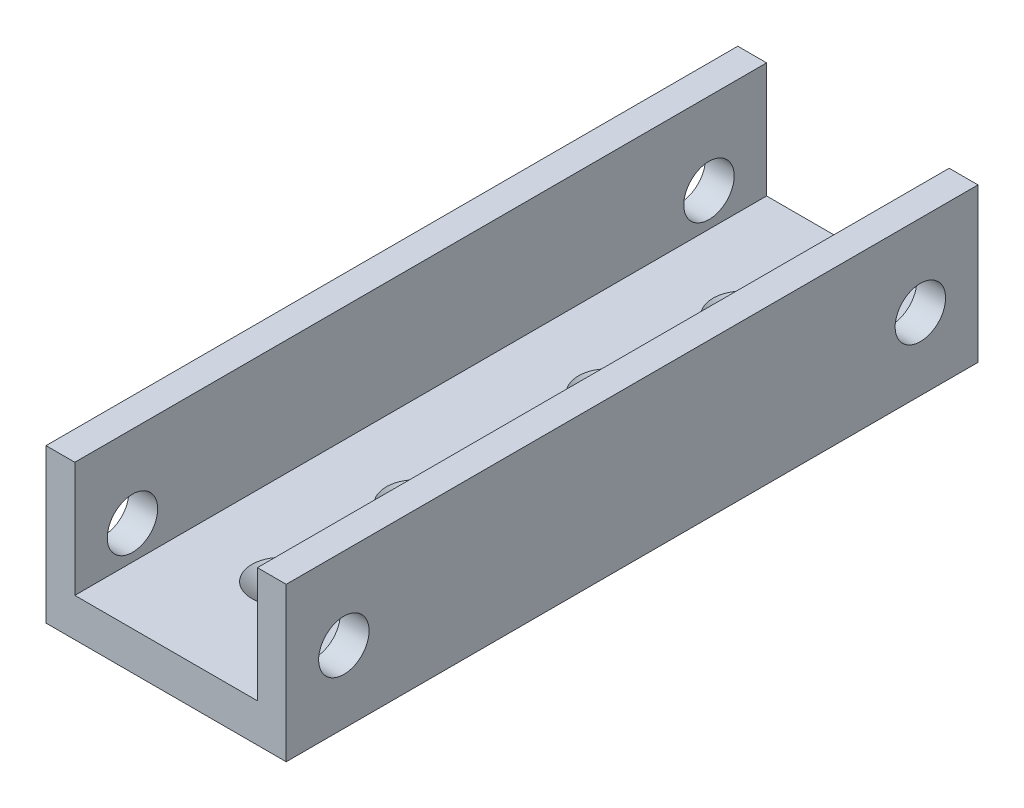
ISO-10303-21;
HEADER;
FILE_DESCRIPTION(('STEP AP214'),'2;1');
FILE_NAME('part.step','',(''),(''),'','','');
FILE_SCHEMA(('AUTOMOTIVE_DESIGN { 1 0 10303 214 1 1 1 1 }'));
ENDSEC;
DATA;
#1=APPLICATION_CONTEXT('core data for automotive mechanical design processes');
#2=APPLICATION_PROTOCOL_DEFINITION('international standard','automotive_design',2000,#1);
#3=PRODUCT_CONTEXT('',#1,'mechanical');
#4=PRODUCT('Part','Part','',(#3));
#5=PRODUCT_RELATED_PRODUCT_CATEGORY('part','',(#4));
#6=PRODUCT_DEFINITION_FORMATION('','',#4);
#7=PRODUCT_DEFINITION_CONTEXT('part definition',#1,'design');
#8=PRODUCT_DEFINITION('design','',#6,#7);
#9=PRODUCT_DEFINITION_SHAPE('','',#8);
#10=(LENGTH_UNIT() NAMED_UNIT(*) SI_UNIT(.MILLI.,.METRE.));
#11=(NAMED_UNIT(*) PLANE_ANGLE_UNIT() SI_UNIT($,.RADIAN.));
#12=(NAMED_UNIT(*) SI_UNIT($,.STERADIAN.) SOLID_ANGLE_UNIT());
#13=UNCERTAINTY_MEASURE_WITH_UNIT(LENGTH_MEASURE(1.E-05),#10,'distance_accuracy_value','');
#14=(GEOMETRIC_REPRESENTATION_CONTEXT(3) GLOBAL_UNCERTAINTY_ASSIGNED_CONTEXT((#13)) GLOBAL_UNIT_ASSIGNED_CONTEXT((#10,
#11,#12)) REPRESENTATION_CONTEXT('',''));
#15=CARTESIAN_POINT('',(0.,0.,0.));
#16=DIRECTION('',(0.,0.,1.));
#17=DIRECTION('',(1.,0.,0.));
#18=AXIS2_PLACEMENT_3D('',#15,#16,#17);
#19=CARTESIAN_POINT('',(-15.08125,6.35,57.15));
#20=DIRECTION('',(-1.,0.,0.));
#21=DIRECTION('',(0.,-1.,0.));
#22=AXIS2_PLACEMENT_3D('',#19,#20,#21);
#23=PLANE('',#22);
#24=CARTESIAN_POINT('',(-15.08125,11.90625,-47.625));
#25=DIRECTION('',(-1.,0.,0.));
#26=DIRECTION('',(0.,-1.,0.));
#27=AXIS2_PLACEMENT_3D('',#24,#25,#26);
#28=CIRCLE('',#27,4.1671875);
#29=CARTESIAN_POINT('',(-15.08125,16.0734375,-47.625));
#30=VERTEX_POINT('',#29);
#31=EDGE_CURVE('E173',#30,#30,#28,.T.);
#32=ORIENTED_EDGE('',*,*,#31,.T.);
#33=EDGE_LOOP('',(#32));
#34=FACE_BOUND('',#33,.T.);
#35=CARTESIAN_POINT('',(-15.08125,11.90625,47.625));
#36=DIRECTION('',(-1.,0.,0.));
#37=DIRECTION('',(0.,-1.,0.));
#38=AXIS2_PLACEMENT_3D('',#35,#36,#37);
#39=CIRCLE('',#38,4.1671875);
#40=CARTESIAN_POINT('',(-15.08125,16.0734375,47.625));
#41=VERTEX_POINT('',#40);
#42=EDGE_CURVE('E160',#41,#41,#39,.T.);
#43=ORIENTED_EDGE('',*,*,#42,.T.);
#44=EDGE_LOOP('',(#43));
#45=FACE_BOUND('',#44,.T.);
#46=DIRECTION('',(0.,1.,0.));
#47=VECTOR('',#46,1.);
#48=CARTESIAN_POINT('',(-15.08125,6.35,-57.15));
#49=LINE('',#48,#47);
#50=CARTESIAN_POINT('',(-15.08125,6.35,-57.15));
#51=VERTEX_POINT('',#50);
#52=CARTESIAN_POINT('',(-15.08125,25.4,-57.15));
#53=VERTEX_POINT('',#52);
#54=EDGE_CURVE('E132',#51,#53,#49,.T.);
#55=ORIENTED_EDGE('',*,*,#54,.T.);
#56=DIRECTION('',(0.,0.,-1.));
#57=VECTOR('',#56,1.);
#58=CARTESIAN_POINT('',(-15.08125,25.4,57.15));
#59=LINE('',#58,#57);
#60=CARTESIAN_POINT('',(-15.08125,25.4,57.15));
#61=VERTEX_POINT('',#60);
#62=EDGE_CURVE('E12',#61,#53,#59,.T.);
#63=ORIENTED_EDGE('',*,*,#62,.F.);
#64=DIRECTION('',(0.,1.,0.));
#65=VECTOR('',#64,1.);
#66=CARTESIAN_POINT('',(-15.08125,6.35,57.15));
#67=LINE('',#66,#65);
#68=CARTESIAN_POINT('',(-15.08125,6.35,57.15));
#69=VERTEX_POINT('',#68);
#70=EDGE_CURVE('E147',#69,#61,#67,.T.);
#71=ORIENTED_EDGE('',*,*,#70,.F.);
#72=DIRECTION('',(0.,0.,-1.));
#73=VECTOR('',#72,1.);
#74=CARTESIAN_POINT('',(-15.08125,6.35,57.15));
#75=LINE('',#74,#73);
#76=EDGE_CURVE('E128',#69,#51,#75,.T.);
#77=ORIENTED_EDGE('',*,*,#76,.T.);
#78=EDGE_LOOP('',(#55,#63,#71,#77));
#79=FACE_BOUND('',#78,.T.);
#80=ADVANCED_FACE('F34',(#34,#45,#79),#23,.F.);
#81=CARTESIAN_POINT('',(-15.08125,25.4,57.15));
#82=DIRECTION('',(0.,-1.,0.));
#83=DIRECTION('',(1.,0.,0.));
#84=AXIS2_PLACEMENT_3D('',#81,#82,#83);
#85=PLANE('',#84);
#86=DIRECTION('',(-1.,0.,0.));
#87=VECTOR('',#86,1.);
#88=CARTESIAN_POINT('',(-15.08125,25.4,-57.15));
#89=LINE('',#88,#87);
#90=CARTESIAN_POINT('',(-19.84375,25.4,-57.15));
#91=VERTEX_POINT('',#90);
#92=EDGE_CURVE('E135',#53,#91,#89,.T.);
#93=ORIENTED_EDGE('',*,*,#92,.T.);
#94=DIRECTION('',(0.,0.,-1.));
#95=VECTOR('',#94,1.);
#96=CARTESIAN_POINT('',(-19.84375,25.4,57.15));
#97=LINE('',#96,#95);
#98=CARTESIAN_POINT('',(-19.84375,25.4,57.15));
#99=VERTEX_POINT('',#98);
#100=EDGE_CURVE('E43',#99,#91,#97,.T.);
#101=ORIENTED_EDGE('',*,*,#100,.F.);
#102=DIRECTION('',(-1.,0.,0.));
#103=VECTOR('',#102,1.);
#104=CARTESIAN_POINT('',(-15.08125,25.4,57.15));
#105=LINE('',#104,#103);
#106=EDGE_CURVE('E95',#61,#99,#105,.T.);
#107=ORIENTED_EDGE('',*,*,#106,.F.);
#108=ORIENTED_EDGE('',*,*,#62,.T.);
#109=EDGE_LOOP('',(#93,#101,#107,#108));
#110=FACE_BOUND('',#109,.T.);
#111=ADVANCED_FACE('F249',(#110),#85,.F.);
#112=CARTESIAN_POINT('',(-19.84375,25.4,57.15));
#113=DIRECTION('',(1.,0.,0.));
#114=DIRECTION('',(0.,1.,0.));
#115=AXIS2_PLACEMENT_3D('',#112,#113,#114);
#116=PLANE('',#115);
#117=CARTESIAN_POINT('',(-19.84375,11.90625,-47.625));
#118=DIRECTION('',(1.,0.,0.));
#119=DIRECTION('',(0.,1.,0.));
#120=AXIS2_PLACEMENT_3D('',#117,#118,#119);
#121=CIRCLE('',#120,4.1671875);
#122=CARTESIAN_POINT('',(-19.84375,16.0734375,-47.625));
#123=VERTEX_POINT('',#122);
#124=EDGE_CURVE('E377',#123,#123,#121,.T.);
#125=ORIENTED_EDGE('',*,*,#124,.T.);
#126=EDGE_LOOP('',(#125));
#127=FACE_BOUND('',#126,.T.);
#128=CARTESIAN_POINT('',(-19.84375,11.90625,47.625));
#129=DIRECTION('',(1.,0.,0.));
#130=DIRECTION('',(0.,1.,0.));
#131=AXIS2_PLACEMENT_3D('',#128,#129,#130);
#132=CIRCLE('',#131,4.1671875);
#133=CARTESIAN_POINT('',(-19.84375,16.0734375,47.625));
#134=VERTEX_POINT('',#133);
#135=EDGE_CURVE('E161',#134,#134,#132,.T.);
#136=ORIENTED_EDGE('',*,*,#135,.T.);
#137=EDGE_LOOP('',(#136));
#138=FACE_BOUND('',#137,.T.);
#139=DIRECTION('',(0.,-1.,0.));
#140=VECTOR('',#139,1.);
#141=CARTESIAN_POINT('',(-19.84375,25.4,-57.15));
#142=LINE('',#141,#140);
#143=CARTESIAN_POINT('',(-19.84375,0.,-57.15));
#144=VERTEX_POINT('',#143);
#145=EDGE_CURVE('E138',#91,#144,#142,.T.);
#146=ORIENTED_EDGE('',*,*,#145,.T.);
#147=DIRECTION('',(0.,0.,-1.));
#148=VECTOR('',#147,1.);
#149=CARTESIAN_POINT('',(-19.84375,0.,57.15));
#150=LINE('',#149,#148);
#151=CARTESIAN_POINT('',(-19.84375,0.,57.15));
#152=VERTEX_POINT('',#151);
#153=EDGE_CURVE('E154',#152,#144,#150,.T.);
#154=ORIENTED_EDGE('',*,*,#153,.F.);
#155=DIRECTION('',(0.,-1.,0.));
#156=VECTOR('',#155,1.);
#157=CARTESIAN_POINT('',(-19.84375,25.4,57.15));
#158=LINE('',#157,#156);
#159=EDGE_CURVE('E214',#99,#152,#158,.T.);
#160=ORIENTED_EDGE('',*,*,#159,.F.);
#161=ORIENTED_EDGE('',*,*,#100,.T.);
#162=EDGE_LOOP('',(#146,#154,#160,#161));
#163=FACE_BOUND('',#162,.T.);
#164=ADVANCED_FACE('F254',(#127,#138,#163),#116,.F.);
#165=CARTESIAN_POINT('',(-19.84375,0.,57.15));
#166=DIRECTION('',(0.,1.,0.));
#167=DIRECTION('',(0.,0.,1.));
#168=AXIS2_PLACEMENT_3D('',#165,#166,#167);
#169=PLANE('',#168);
#170=CARTESIAN_POINT('',(0.,0.,-15.875));
#171=DIRECTION('',(0.,1.,0.));
#172=DIRECTION('',(0.,0.,1.));
#173=AXIS2_PLACEMENT_3D('',#170,#171,#172);
#174=CIRCLE('',#173,2.5527);
#175=CARTESIAN_POINT('',(0.,0.,-13.3223));
#176=VERTEX_POINT('',#175);
#177=EDGE_CURVE('E183',#176,#176,#174,.T.);
#178=ORIENTED_EDGE('',*,*,#177,.T.);
#179=EDGE_LOOP('',(#178));
#180=FACE_BOUND('',#179,.T.);
#181=CARTESIAN_POINT('',(0.,0.,-38.1));
#182=DIRECTION('',(0.,1.,0.));
#183=DIRECTION('',(0.,0.,1.));
#184=AXIS2_PLACEMENT_3D('',#181,#182,#183);
#185=CIRCLE('',#184,2.5527);
#186=CARTESIAN_POINT('',(0.,0.,-35.5473));
#187=VERTEX_POINT('',#186);
#188=EDGE_CURVE('E192',#187,#187,#185,.T.);
#189=ORIENTED_EDGE('',*,*,#188,.T.);
#190=EDGE_LOOP('',(#189));
#191=FACE_BOUND('',#190,.T.);
#192=CARTESIAN_POINT('',(0.,0.,15.875));
#193=DIRECTION('',(0.,1.,0.));
#194=DIRECTION('',(0.,0.,1.));
#195=AXIS2_PLACEMENT_3D('',#192,#193,#194);
#196=CIRCLE('',#195,2.5527);
#197=CARTESIAN_POINT('',(0.,0.,18.4277));
#198=VERTEX_POINT('',#197);
#199=EDGE_CURVE('E201',#198,#198,#196,.T.);
#200=ORIENTED_EDGE('',*,*,#199,.T.);
#201=EDGE_LOOP('',(#200));
#202=FACE_BOUND('',#201,.T.);
#203=CARTESIAN_POINT('',(0.,0.,38.1));
#204=DIRECTION('',(0.,1.,0.));
#205=DIRECTION('',(0.,0.,1.));
#206=AXIS2_PLACEMENT_3D('',#203,#204,#205);
#207=CIRCLE('',#206,2.5527);
#208=CARTESIAN_POINT('',(0.,0.,40.6527));
#209=VERTEX_POINT('',#208);
#210=EDGE_CURVE('E136',#209,#209,#207,.T.);
#211=ORIENTED_EDGE('',*,*,#210,.T.);
#212=EDGE_LOOP('',(#211));
#213=FACE_BOUND('',#212,.T.);
#214=DIRECTION('',(1.,0.,0.));
#215=VECTOR('',#214,1.);
#216=CARTESIAN_POINT('',(-19.84375,0.,-57.15));
#217=LINE('',#216,#215);
#218=CARTESIAN_POINT('',(19.84375,0.,-57.15));
#219=VERTEX_POINT('',#218);
#220=EDGE_CURVE('E140',#144,#219,#217,.T.);
#221=ORIENTED_EDGE('',*,*,#220,.T.);
#222=DIRECTION('',(0.,0.,-1.));
#223=VECTOR('',#222,1.);
#224=CARTESIAN_POINT('',(19.84375,0.,57.15));
#225=LINE('',#224,#223);
#226=CARTESIAN_POINT('',(19.84375,0.,57.15));
#227=VERTEX_POINT('',#226);
#228=EDGE_CURVE('E151',#227,#219,#225,.T.);
#229=ORIENTED_EDGE('',*,*,#228,.F.);
#230=DIRECTION('',(1.,0.,0.));
#231=VECTOR('',#230,1.);
#232=CARTESIAN_POINT('',(-19.84375,0.,57.15));
#233=LINE('',#232,#231);
#234=EDGE_CURVE('E216',#152,#227,#233,.T.);
#235=ORIENTED_EDGE('',*,*,#234,.F.);
#236=ORIENTED_EDGE('',*,*,#153,.T.);
#237=EDGE_LOOP('',(#221,#229,#235,#236));
#238=FACE_BOUND('',#237,.T.);
#239=ADVANCED_FACE('F222',(#180,#191,#202,#213,#238),#169,.F.);
#240=CARTESIAN_POINT('',(19.84375,0.,57.15));
#241=DIRECTION('',(-1.,0.,0.));
#242=DIRECTION('',(0.,-1.,0.));
#243=AXIS2_PLACEMENT_3D('',#240,#241,#242);
#244=PLANE('',#243);
#245=CARTESIAN_POINT('',(19.84375,11.90625,-47.625));
#246=DIRECTION('',(1.,0.,0.));
#247=DIRECTION('',(0.,1.,0.));
#248=AXIS2_PLACEMENT_3D('',#245,#246,#247);
#249=CIRCLE('',#248,4.1671875);
#250=CARTESIAN_POINT('',(19.84375,16.0734375,-47.625));
#251=VERTEX_POINT('',#250);
#252=EDGE_CURVE('E380',#251,#251,#249,.T.);
#253=ORIENTED_EDGE('',*,*,#252,.F.);
#254=EDGE_LOOP('',(#253));
#255=FACE_BOUND('',#254,.T.);
#256=CARTESIAN_POINT('',(19.84375,11.90625,47.625));
#257=DIRECTION('',(1.,0.,0.));
#258=DIRECTION('',(0.,1.,0.));
#259=AXIS2_PLACEMENT_3D('',#256,#257,#258);
#260=CIRCLE('',#259,4.1671875);
#261=CARTESIAN_POINT('',(19.84375,16.0734375,47.625));
#262=VERTEX_POINT('',#261);
#263=EDGE_CURVE('E168',#262,#262,#260,.T.);
#264=ORIENTED_EDGE('',*,*,#263,.F.);
#265=EDGE_LOOP('',(#264));
#266=FACE_BOUND('',#265,.T.);
#267=DIRECTION('',(0.,1.,0.));
#268=VECTOR('',#267,1.);
#269=CARTESIAN_POINT('',(19.84375,0.,-57.15));
#270=LINE('',#269,#268);
#271=CARTESIAN_POINT('',(19.84375,25.4,-57.15));
#272=VERTEX_POINT('',#271);
#273=EDGE_CURVE('E142',#219,#272,#270,.T.);
#274=ORIENTED_EDGE('',*,*,#273,.T.);
#275=DIRECTION('',(0.,0.,-1.));
#276=VECTOR('',#275,1.);
#277=CARTESIAN_POINT('',(19.84375,25.4,57.15));
#278=LINE('',#277,#276);
#279=CARTESIAN_POINT('',(19.84375,25.4,57.15));
#280=VERTEX_POINT('',#279);
#281=EDGE_CURVE('E123',#280,#272,#278,.T.);
#282=ORIENTED_EDGE('',*,*,#281,.F.);
#283=DIRECTION('',(0.,1.,0.));
#284=VECTOR('',#283,1.);
#285=CARTESIAN_POINT('',(19.84375,0.,57.15));
#286=LINE('',#285,#284);
#287=EDGE_CURVE('E114',#227,#280,#286,.T.);
#288=ORIENTED_EDGE('',*,*,#287,.F.);
#289=ORIENTED_EDGE('',*,*,#228,.T.);
#290=EDGE_LOOP('',(#274,#282,#288,#289));
#291=FACE_BOUND('',#290,.T.);
#292=ADVANCED_FACE('F226',(#255,#266,#291),#244,.F.);
#293=CARTESIAN_POINT('',(19.84375,25.4,57.15));
#294=DIRECTION('',(0.,-1.,0.));
#295=DIRECTION('',(1.,0.,0.));
#296=AXIS2_PLACEMENT_3D('',#293,#294,#295);
#297=PLANE('',#296);
#298=DIRECTION('',(-1.,0.,0.));
#299=VECTOR('',#298,1.);
#300=CARTESIAN_POINT('',(19.84375,25.4,-57.15));
#301=LINE('',#300,#299);
#302=CARTESIAN_POINT('',(15.08125,25.4,-57.15));
#303=VERTEX_POINT('',#302);
#304=EDGE_CURVE('E122',#272,#303,#301,.T.);
#305=ORIENTED_EDGE('',*,*,#304,.T.);
#306=DIRECTION('',(0.,0.,-1.));
#307=VECTOR('',#306,1.);
#308=CARTESIAN_POINT('',(15.08125,25.4,57.15));
#309=LINE('',#308,#307);
#310=CARTESIAN_POINT('',(15.08125,25.4,57.15));
#311=VERTEX_POINT('',#310);
#312=EDGE_CURVE('E119',#311,#303,#309,.T.);
#313=ORIENTED_EDGE('',*,*,#312,.F.);
#314=DIRECTION('',(-1.,0.,0.));
#315=VECTOR('',#314,1.);
#316=CARTESIAN_POINT('',(19.84375,25.4,57.15));
#317=LINE('',#316,#315);
#318=EDGE_CURVE('E108',#280,#311,#317,.T.);
#319=ORIENTED_EDGE('',*,*,#318,.F.);
#320=ORIENTED_EDGE('',*,*,#281,.T.);
#321=EDGE_LOOP('',(#305,#313,#319,#320));
#322=FACE_BOUND('',#321,.T.);
#323=ADVANCED_FACE('F120',(#322),#297,.F.);
#324=CARTESIAN_POINT('',(15.08125,25.4,57.15));
#325=DIRECTION('',(1.,0.,0.));
#326=DIRECTION('',(0.,1.,0.));
#327=AXIS2_PLACEMENT_3D('',#324,#325,#326);
#328=PLANE('',#327);
#329=CARTESIAN_POINT('',(15.08125,11.90625,-47.625));
#330=DIRECTION('',(1.,0.,0.));
#331=DIRECTION('',(0.,1.,0.));
#332=AXIS2_PLACEMENT_3D('',#329,#330,#331);
#333=CIRCLE('',#332,4.1671875);
#334=CARTESIAN_POINT('',(15.08125,16.0734375,-47.625));
#335=VERTEX_POINT('',#334);
#336=EDGE_CURVE('E37',#335,#335,#333,.T.);
#337=ORIENTED_EDGE('',*,*,#336,.T.);
#338=EDGE_LOOP('',(#337));
#339=FACE_BOUND('',#338,.T.);
#340=CARTESIAN_POINT('',(15.08125,11.90625,47.625));
#341=DIRECTION('',(1.,0.,0.));
#342=DIRECTION('',(0.,1.,0.));
#343=AXIS2_PLACEMENT_3D('',#340,#341,#342);
#344=CIRCLE('',#343,4.1671875);
#345=CARTESIAN_POINT('',(15.08125,16.0734375,47.625));
#346=VERTEX_POINT('',#345);
#347=EDGE_CURVE('E158',#346,#346,#344,.T.);
#348=ORIENTED_EDGE('',*,*,#347,.T.);
#349=EDGE_LOOP('',(#348));
#350=FACE_BOUND('',#349,.T.);
#351=DIRECTION('',(0.,-1.,0.));
#352=VECTOR('',#351,1.);
#353=CARTESIAN_POINT('',(15.08125,25.4,-57.15));
#354=LINE('',#353,#352);
#355=CARTESIAN_POINT('',(15.08125,6.35,-57.15));
#356=VERTEX_POINT('',#355);
#357=EDGE_CURVE('E81',#303,#356,#354,.T.);
#358=ORIENTED_EDGE('',*,*,#357,.T.);
#359=DIRECTION('',(0.,0.,-1.));
#360=VECTOR('',#359,1.);
#361=CARTESIAN_POINT('',(15.08125,6.35,57.15));
#362=LINE('',#361,#360);
#363=CARTESIAN_POINT('',(15.08125,6.35,57.15));
#364=VERTEX_POINT('',#363);
#365=EDGE_CURVE('E124',#364,#356,#362,.T.);
#366=ORIENTED_EDGE('',*,*,#365,.F.);
#367=DIRECTION('',(0.,-1.,0.));
#368=VECTOR('',#367,1.);
#369=CARTESIAN_POINT('',(15.08125,25.4,57.15));
#370=LINE('',#369,#368);
#371=EDGE_CURVE('E112',#311,#364,#370,.T.);
#372=ORIENTED_EDGE('',*,*,#371,.F.);
#373=ORIENTED_EDGE('',*,*,#312,.T.);
#374=EDGE_LOOP('',(#358,#366,#372,#373));
#375=FACE_BOUND('',#374,.T.);
#376=ADVANCED_FACE('F126',(#339,#350,#375),#328,.F.);
#377=CARTESIAN_POINT('',(15.08125,6.35,57.15));
#378=DIRECTION('',(0.,-1.,0.));
#379=DIRECTION('',(1.,0.,0.));
#380=AXIS2_PLACEMENT_3D('',#377,#378,#379);
#381=PLANE('',#380);
#382=CARTESIAN_POINT('',(0.,6.35,-15.875));
#383=DIRECTION('',(0.,1.,0.));
#384=DIRECTION('',(0.,0.,1.));
#385=AXIS2_PLACEMENT_3D('',#382,#383,#384);
#386=CIRCLE('',#385,4.8895);
#387=CARTESIAN_POINT('',(0.,6.35,-10.9855));
#388=VERTEX_POINT('',#387);
#389=EDGE_CURVE('E165',#388,#388,#386,.T.);
#390=ORIENTED_EDGE('',*,*,#389,.F.);
#391=EDGE_LOOP('',(#390));
#392=FACE_BOUND('',#391,.T.);
#393=CARTESIAN_POINT('',(0.,6.35,-38.1));
#394=DIRECTION('',(0.,1.,0.));
#395=DIRECTION('',(0.,0.,1.));
#396=AXIS2_PLACEMENT_3D('',#393,#394,#395);
#397=CIRCLE('',#396,4.8895);
#398=CARTESIAN_POINT('',(0.,6.35,-33.2105));
#399=VERTEX_POINT('',#398);
#400=EDGE_CURVE('E186',#399,#399,#397,.T.);
#401=ORIENTED_EDGE('',*,*,#400,.F.);
#402=EDGE_LOOP('',(#401));
#403=FACE_BOUND('',#402,.T.);
#404=CARTESIAN_POINT('',(0.,6.35,15.875));
#405=DIRECTION('',(0.,1.,0.));
#406=DIRECTION('',(0.,0.,1.));
#407=AXIS2_PLACEMENT_3D('',#404,#405,#406);
#408=CIRCLE('',#407,4.8895);
#409=CARTESIAN_POINT('',(0.,6.35,20.7645));
#410=VERTEX_POINT('',#409);
#411=EDGE_CURVE('E195',#410,#410,#408,.T.);
#412=ORIENTED_EDGE('',*,*,#411,.F.);
#413=EDGE_LOOP('',(#412));
#414=FACE_BOUND('',#413,.T.);
#415=CARTESIAN_POINT('',(0.,6.35,38.1));
#416=DIRECTION('',(0.,1.,0.));
#417=DIRECTION('',(0.,0.,1.));
#418=AXIS2_PLACEMENT_3D('',#415,#416,#417);
#419=CIRCLE('',#418,4.8895);
#420=CARTESIAN_POINT('',(0.,6.35,42.9895));
#421=VERTEX_POINT('',#420);
#422=EDGE_CURVE('E204',#421,#421,#419,.T.);
#423=ORIENTED_EDGE('',*,*,#422,.F.);
#424=EDGE_LOOP('',(#423));
#425=FACE_BOUND('',#424,.T.);
#426=DIRECTION('',(-1.,0.,0.));
#427=VECTOR('',#426,1.);
#428=CARTESIAN_POINT('',(15.08125,6.35,-57.15));
#429=LINE('',#428,#427);
#430=EDGE_CURVE('E87',#356,#51,#429,.T.);
#431=ORIENTED_EDGE('',*,*,#430,.T.);
#432=ORIENTED_EDGE('',*,*,#76,.F.);
#433=DIRECTION('',(-1.,0.,0.));
#434=VECTOR('',#433,1.);
#435=CARTESIAN_POINT('',(15.08125,6.35,57.15));
#436=LINE('',#435,#434);
#437=EDGE_CURVE('E52',#364,#69,#436,.T.);
#438=ORIENTED_EDGE('',*,*,#437,.F.);
#439=ORIENTED_EDGE('',*,*,#365,.T.);
#440=EDGE_LOOP('',(#431,#432,#438,#439));
#441=FACE_BOUND('',#440,.T.);
#442=ADVANCED_FACE('F234',(#392,#403,#414,#425,#441),#381,.F.);
#443=CARTESIAN_POINT('',(0.,0.,57.15));
#444=DIRECTION('',(0.,0.,1.));
#445=DIRECTION('',(1.,0.,0.));
#446=AXIS2_PLACEMENT_3D('',#443,#444,#445);
#447=PLANE('',#446);
#448=ORIENTED_EDGE('',*,*,#70,.T.);
#449=ORIENTED_EDGE('',*,*,#106,.T.);
#450=ORIENTED_EDGE('',*,*,#159,.T.);
#451=ORIENTED_EDGE('',*,*,#234,.T.);
#452=ORIENTED_EDGE('',*,*,#287,.T.);
#453=ORIENTED_EDGE('',*,*,#318,.T.);
#454=ORIENTED_EDGE('',*,*,#371,.T.);
#455=ORIENTED_EDGE('',*,*,#437,.T.);
#456=EDGE_LOOP('',(#448,#449,#450,#451,#452,#453,#454,#455));
#457=FACE_BOUND('',#456,.T.);
#458=ADVANCED_FACE('F110',(#457),#447,.T.);
#459=CARTESIAN_POINT('',(0.,0.,-57.15));
#460=DIRECTION('',(0.,0.,1.));
#461=DIRECTION('',(1.,0.,0.));
#462=AXIS2_PLACEMENT_3D('',#459,#460,#461);
#463=PLANE('',#462);
#464=ORIENTED_EDGE('',*,*,#54,.F.);
#465=ORIENTED_EDGE('',*,*,#430,.F.);
#466=ORIENTED_EDGE('',*,*,#357,.F.);
#467=ORIENTED_EDGE('',*,*,#304,.F.);
#468=ORIENTED_EDGE('',*,*,#273,.F.);
#469=ORIENTED_EDGE('',*,*,#220,.F.);
#470=ORIENTED_EDGE('',*,*,#145,.F.);
#471=ORIENTED_EDGE('',*,*,#92,.F.);
#472=EDGE_LOOP('',(#464,#465,#466,#467,#468,#469,#470,#471));
#473=FACE_BOUND('',#472,.T.);
#474=ADVANCED_FACE('F229',(#473),#463,.F.);
#475=CARTESIAN_POINT('',(0.,6.35,38.1));
#476=DIRECTION('',(0.,1.,0.));
#477=DIRECTION('',(0.,0.,1.));
#478=AXIS2_PLACEMENT_3D('',#475,#476,#477);
#479=CYLINDRICAL_SURFACE('',#478,2.5527);
#480=ORIENTED_EDGE('',*,*,#210,.F.);
#481=EDGE_LOOP('',(#480));
#482=FACE_BOUND('',#481,.T.);
#483=CARTESIAN_POINT('',(0.,4.38919198186493,38.1));
#484=DIRECTION('',(0.,1.,0.));
#485=DIRECTION('',(0.,0.,1.));
#486=AXIS2_PLACEMENT_3D('',#483,#484,#485);
#487=CIRCLE('',#486,2.5527);
#488=CARTESIAN_POINT('',(0.,4.38919198186493,40.6527));
#489=VERTEX_POINT('',#488);
#490=EDGE_CURVE('E207',#489,#489,#487,.T.);
#491=ORIENTED_EDGE('',*,*,#490,.T.);
#492=EDGE_LOOP('',(#491));
#493=FACE_BOUND('',#492,.T.);
#494=ADVANCED_FACE('F302',(#482,#493),#479,.F.);
#495=CARTESIAN_POINT('',(0.,6.35,38.1));
#496=DIRECTION('',(0.,1.,0.));
#497=DIRECTION('',(0.,0.,1.));
#498=AXIS2_PLACEMENT_3D('',#495,#496,#497);
#499=CONICAL_SURFACE('',#498,4.8895,0.872664625997165);
#500=ORIENTED_EDGE('',*,*,#490,.F.);
#501=EDGE_LOOP('',(#500));
#502=FACE_BOUND('',#501,.T.);
#503=ORIENTED_EDGE('',*,*,#422,.T.);
#504=EDGE_LOOP('',(#503));
#505=FACE_BOUND('',#504,.T.);
#506=ADVANCED_FACE('F298',(#502,#505),#499,.F.);
#507=CARTESIAN_POINT('',(0.,6.35,15.875));
#508=DIRECTION('',(0.,1.,0.));
#509=DIRECTION('',(0.,0.,1.));
#510=AXIS2_PLACEMENT_3D('',#507,#508,#509);
#511=CYLINDRICAL_SURFACE('',#510,2.5527);
#512=ORIENTED_EDGE('',*,*,#199,.F.);
#513=EDGE_LOOP('',(#512));
#514=FACE_BOUND('',#513,.T.);
#515=CARTESIAN_POINT('',(0.,4.38919198186493,15.875));
#516=DIRECTION('',(0.,1.,0.));
#517=DIRECTION('',(0.,0.,1.));
#518=AXIS2_PLACEMENT_3D('',#515,#516,#517);
#519=CIRCLE('',#518,2.5527);
#520=CARTESIAN_POINT('',(0.,4.38919198186493,18.4277));
#521=VERTEX_POINT('',#520);
#522=EDGE_CURVE('E198',#521,#521,#519,.T.);
#523=ORIENTED_EDGE('',*,*,#522,.T.);
#524=EDGE_LOOP('',(#523));
#525=FACE_BOUND('',#524,.T.);
#526=ADVANCED_FACE('F294',(#514,#525),#511,.F.);
#527=CARTESIAN_POINT('',(0.,6.35,15.875));
#528=DIRECTION('',(0.,1.,0.));
#529=DIRECTION('',(0.,0.,1.));
#530=AXIS2_PLACEMENT_3D('',#527,#528,#529);
#531=CONICAL_SURFACE('',#530,4.8895,0.872664625997165);
#532=ORIENTED_EDGE('',*,*,#522,.F.);
#533=EDGE_LOOP('',(#532));
#534=FACE_BOUND('',#533,.T.);
#535=ORIENTED_EDGE('',*,*,#411,.T.);
#536=EDGE_LOOP('',(#535));
#537=FACE_BOUND('',#536,.T.);
#538=ADVANCED_FACE('F290',(#534,#537),#531,.F.);
#539=CARTESIAN_POINT('',(0.,6.35,-38.1));
#540=DIRECTION('',(0.,1.,0.));
#541=DIRECTION('',(0.,0.,1.));
#542=AXIS2_PLACEMENT_3D('',#539,#540,#541);
#543=CYLINDRICAL_SURFACE('',#542,2.5527);
#544=ORIENTED_EDGE('',*,*,#188,.F.);
#545=EDGE_LOOP('',(#544));
#546=FACE_BOUND('',#545,.T.);
#547=CARTESIAN_POINT('',(0.,4.38919198186493,-38.1));
#548=DIRECTION('',(0.,1.,0.));
#549=DIRECTION('',(0.,0.,1.));
#550=AXIS2_PLACEMENT_3D('',#547,#548,#549);
#551=CIRCLE('',#550,2.5527);
#552=CARTESIAN_POINT('',(0.,4.38919198186493,-35.5473));
#553=VERTEX_POINT('',#552);
#554=EDGE_CURVE('E189',#553,#553,#551,.T.);
#555=ORIENTED_EDGE('',*,*,#554,.T.);
#556=EDGE_LOOP('',(#555));
#557=FACE_BOUND('',#556,.T.);
#558=ADVANCED_FACE('F286',(#546,#557),#543,.F.);
#559=CARTESIAN_POINT('',(0.,6.35,-38.1));
#560=DIRECTION('',(0.,1.,0.));
#561=DIRECTION('',(0.,0.,1.));
#562=AXIS2_PLACEMENT_3D('',#559,#560,#561);
#563=CONICAL_SURFACE('',#562,4.8895,0.872664625997165);
#564=ORIENTED_EDGE('',*,*,#554,.F.);
#565=EDGE_LOOP('',(#564));
#566=FACE_BOUND('',#565,.T.);
#567=ORIENTED_EDGE('',*,*,#400,.T.);
#568=EDGE_LOOP('',(#567));
#569=FACE_BOUND('',#568,.T.);
#570=ADVANCED_FACE('F282',(#566,#569),#563,.F.);
#571=CARTESIAN_POINT('',(0.,6.35,-15.875));
#572=DIRECTION('',(0.,1.,0.));
#573=DIRECTION('',(0.,0.,1.));
#574=AXIS2_PLACEMENT_3D('',#571,#572,#573);
#575=CYLINDRICAL_SURFACE('',#574,2.5527);
#576=ORIENTED_EDGE('',*,*,#177,.F.);
#577=EDGE_LOOP('',(#576));
#578=FACE_BOUND('',#577,.T.);
#579=CARTESIAN_POINT('',(0.,4.38919198186493,-15.875));
#580=DIRECTION('',(0.,1.,0.));
#581=DIRECTION('',(0.,0.,1.));
#582=AXIS2_PLACEMENT_3D('',#579,#580,#581);
#583=CIRCLE('',#582,2.5527);
#584=CARTESIAN_POINT('',(0.,4.38919198186493,-13.3223));
#585=VERTEX_POINT('',#584);
#586=EDGE_CURVE('E180',#585,#585,#583,.T.);
#587=ORIENTED_EDGE('',*,*,#586,.T.);
#588=EDGE_LOOP('',(#587));
#589=FACE_BOUND('',#588,.T.);
#590=ADVANCED_FACE('F278',(#578,#589),#575,.F.);
#591=CARTESIAN_POINT('',(0.,6.35,-15.875));
#592=DIRECTION('',(0.,1.,0.));
#593=DIRECTION('',(0.,0.,1.));
#594=AXIS2_PLACEMENT_3D('',#591,#592,#593);
#595=CONICAL_SURFACE('',#594,4.8895,0.872664625997165);
#596=ORIENTED_EDGE('',*,*,#586,.F.);
#597=EDGE_LOOP('',(#596));
#598=FACE_BOUND('',#597,.T.);
#599=ORIENTED_EDGE('',*,*,#389,.T.);
#600=EDGE_LOOP('',(#599));
#601=FACE_BOUND('',#600,.T.);
#602=ADVANCED_FACE('F273',(#598,#601),#595,.F.);
#603=CARTESIAN_POINT('',(-19.84375,11.90625,47.625));
#604=DIRECTION('',(1.,0.,0.));
#605=DIRECTION('',(0.,1.,0.));
#606=AXIS2_PLACEMENT_3D('',#603,#604,#605);
#607=CYLINDRICAL_SURFACE('',#606,4.1671875);
#608=CARTESIAN_POINT('',(19.84375,16.0734375,47.625));
#609=CARTESIAN_POINT('',(19.794140625,16.0734375,47.625));
#610=CARTESIAN_POINT('',(19.74453125,16.0734375,47.625));
#611=CARTESIAN_POINT('',(19.6453125,16.0734375,47.625));
#612=CARTESIAN_POINT('',(19.595703125,16.0734375,47.625));
#613=CARTESIAN_POINT('',(19.496484375,16.0734375,47.625));
#614=CARTESIAN_POINT('',(19.446875,16.0734375,47.625));
#615=CARTESIAN_POINT('',(19.34765625,16.0734375,47.625));
#616=CARTESIAN_POINT('',(19.298046875,16.0734375,47.625));
#617=CARTESIAN_POINT('',(19.198828125,16.0734375,47.625));
#618=CARTESIAN_POINT('',(19.14921875,16.0734375,47.625));
#619=CARTESIAN_POINT('',(19.05,16.0734375,47.625));
#620=CARTESIAN_POINT('',(19.000390625,16.0734375,47.625));
#621=CARTESIAN_POINT('',(18.901171875,16.0734375,47.625));
#622=CARTESIAN_POINT('',(18.8515625,16.0734375,47.625));
#623=CARTESIAN_POINT('',(18.75234375,16.0734375,47.625));
#624=CARTESIAN_POINT('',(18.702734375,16.0734375,47.625));
#625=CARTESIAN_POINT('',(18.603515625,16.0734375,47.625));
#626=CARTESIAN_POINT('',(18.55390625,16.0734375,47.625));
#627=CARTESIAN_POINT('',(18.4546875,16.0734375,47.625));
#628=CARTESIAN_POINT('',(18.405078125,16.0734375,47.625));
#629=CARTESIAN_POINT('',(18.305859375,16.0734375,47.625));
#630=CARTESIAN_POINT('',(18.25625,16.0734375,47.625));
#631=CARTESIAN_POINT('',(18.15703125,16.0734375,47.625));
#632=CARTESIAN_POINT('',(18.107421875,16.0734375,47.625));
#633=CARTESIAN_POINT('',(18.008203125,16.0734375,47.625));
#634=CARTESIAN_POINT('',(17.95859375,16.0734375,47.625));
#635=CARTESIAN_POINT('',(17.859375,16.0734375,47.625));
#636=CARTESIAN_POINT('',(17.809765625,16.0734375,47.625));
#637=CARTESIAN_POINT('',(17.710546875,16.0734375,47.625));
#638=CARTESIAN_POINT('',(17.6609375,16.0734375,47.625));
#639=CARTESIAN_POINT('',(17.56171875,16.0734375,47.625));
#640=CARTESIAN_POINT('',(17.512109375,16.0734375,47.625));
#641=CARTESIAN_POINT('',(17.412890625,16.0734375,47.625));
#642=CARTESIAN_POINT('',(17.36328125,16.0734375,47.625));
#643=CARTESIAN_POINT('',(17.2640625,16.0734375,47.625));
#644=CARTESIAN_POINT('',(17.214453125,16.0734375,47.625));
#645=CARTESIAN_POINT('',(17.115234375,16.0734375,47.625));
#646=CARTESIAN_POINT('',(17.065625,16.0734375,47.625));
#647=CARTESIAN_POINT('',(16.96640625,16.0734375,47.625));
#648=CARTESIAN_POINT('',(16.916796875,16.0734375,47.625));
#649=CARTESIAN_POINT('',(16.817578125,16.0734375,47.625));
#650=CARTESIAN_POINT('',(16.76796875,16.0734375,47.625));
#651=CARTESIAN_POINT('',(16.66875,16.0734375,47.625));
#652=CARTESIAN_POINT('',(16.619140625,16.0734375,47.625));
#653=CARTESIAN_POINT('',(16.519921875,16.0734375,47.625));
#654=CARTESIAN_POINT('',(16.4703125,16.0734375,47.625));
#655=CARTESIAN_POINT('',(16.37109375,16.0734375,47.625));
#656=CARTESIAN_POINT('',(16.321484375,16.0734375,47.625));
#657=CARTESIAN_POINT('',(16.222265625,16.0734375,47.625));
#658=CARTESIAN_POINT('',(16.17265625,16.0734375,47.625));
#659=CARTESIAN_POINT('',(16.0734375,16.0734375,47.625));
#660=CARTESIAN_POINT('',(16.023828125,16.0734375,47.625));
#661=CARTESIAN_POINT('',(15.924609375,16.0734375,47.625));
#662=CARTESIAN_POINT('',(15.875,16.0734375,47.625));
#663=CARTESIAN_POINT('',(15.77578125,16.0734375,47.625));
#664=CARTESIAN_POINT('',(15.726171875,16.0734375,47.625));
#665=CARTESIAN_POINT('',(15.626953125,16.0734375,47.625));
#666=CARTESIAN_POINT('',(15.57734375,16.0734375,47.625));
#667=CARTESIAN_POINT('',(15.478125,16.0734375,47.625));
#668=CARTESIAN_POINT('',(15.428515625,16.0734375,47.625));
#669=CARTESIAN_POINT('',(15.329296875,16.0734375,47.625));
#670=CARTESIAN_POINT('',(15.2796875,16.0734375,47.625));
#671=CARTESIAN_POINT('',(15.18046875,16.0734375,47.625));
#672=CARTESIAN_POINT('',(15.130859375,16.0734375,47.625));
#673=CARTESIAN_POINT('',(15.08125,16.0734375,47.625));
#674=B_SPLINE_CURVE_WITH_KNOTS('',3,(#608,#609,#610,#611,#612,#613,#614,#615,#616,#617,#618,
#619,#620,#621,#622,#623,#624,#625,#626,#627,#628,#629,#630,#631,#632,#633,#634,#635,#636,#637,
#638,#639,#640,#641,#642,#643,#644,#645,#646,#647,#648,#649,#650,#651,#652,#653,#654,#655,#656,
#657,#658,#659,#660,#661,#662,#663,#664,#665,#666,#667,#668,#669,#670,#671,#672,#673),
.UNSPECIFIED.,.F.,.F.,(4,2,2,2,2,2,2,2,2,2,2,2,2,2,2,2,2,2,2,2,2,2,2,2,2,2,2,2,2,2,2,2,4),(0.,
0.148828125,0.29765625,0.446484375,0.5953125,0.744140625,0.892968750000001,1.041796875,1.190625,
1.33945312500001,1.48828125000001,1.63710937500001,1.78593750000001,1.93476562500001,
2.08359375000001,2.23242187500001,2.38125000000001,2.53007812500001,2.67890625000001,
2.82773437500001,2.97656250000001,3.12539062500001,3.27421875000001,3.42304687500001,
3.57187500000002,3.72070312500002,3.86953125000002,4.01835937500002,4.16718750000002,
4.31601562500002,4.46484375000002,4.61367187500002,4.76250000000002),.UNSPECIFIED.);
#675=EDGE_CURVE('BSEAM263',#262,#346,#674,.T.);
#676=ORIENTED_EDGE('',*,*,#263,.T.);
#677=ORIENTED_EDGE('',*,*,#347,.F.);
#678=ORIENTED_EDGE('',*,*,#675,.T.);
#679=ORIENTED_EDGE('',*,*,#675,.F.);
#680=EDGE_LOOP('',(#676,#678,#677,#679));
#681=FACE_BOUND('',#680,.T.);
#682=ADVANCED_FACE('F263',(#681),#607,.F.);
#683=CARTESIAN_POINT('',(-19.84375,16.0734375,47.625));
#684=CARTESIAN_POINT('',(-19.794140625,16.0734375,47.625));
#685=CARTESIAN_POINT('',(-19.74453125,16.0734375,47.625));
#686=CARTESIAN_POINT('',(-19.6453125,16.0734375,47.625));
#687=CARTESIAN_POINT('',(-19.595703125,16.0734375,47.625));
#688=CARTESIAN_POINT('',(-19.496484375,16.0734375,47.625));
#689=CARTESIAN_POINT('',(-19.446875,16.0734375,47.625));
#690=CARTESIAN_POINT('',(-19.34765625,16.0734375,47.625));
#691=CARTESIAN_POINT('',(-19.298046875,16.0734375,47.625));
#692=CARTESIAN_POINT('',(-19.198828125,16.0734375,47.625));
#693=CARTESIAN_POINT('',(-19.14921875,16.0734375,47.625));
#694=CARTESIAN_POINT('',(-19.05,16.0734375,47.625));
#695=CARTESIAN_POINT('',(-19.000390625,16.0734375,47.625));
#696=CARTESIAN_POINT('',(-18.901171875,16.0734375,47.625));
#697=CARTESIAN_POINT('',(-18.8515625,16.0734375,47.625));
#698=CARTESIAN_POINT('',(-18.75234375,16.0734375,47.625));
#699=CARTESIAN_POINT('',(-18.702734375,16.0734375,47.625));
#700=CARTESIAN_POINT('',(-18.603515625,16.0734375,47.625));
#701=CARTESIAN_POINT('',(-18.55390625,16.0734375,47.625));
#702=CARTESIAN_POINT('',(-18.4546875,16.0734375,47.625));
#703=CARTESIAN_POINT('',(-18.405078125,16.0734375,47.625));
#704=CARTESIAN_POINT('',(-18.305859375,16.0734375,47.625));
#705=CARTESIAN_POINT('',(-18.25625,16.0734375,47.625));
#706=CARTESIAN_POINT('',(-18.15703125,16.0734375,47.625));
#707=CARTESIAN_POINT('',(-18.107421875,16.0734375,47.625));
#708=CARTESIAN_POINT('',(-18.008203125,16.0734375,47.625));
#709=CARTESIAN_POINT('',(-17.95859375,16.0734375,47.625));
#710=CARTESIAN_POINT('',(-17.859375,16.0734375,47.625));
#711=CARTESIAN_POINT('',(-17.809765625,16.0734375,47.625));
#712=CARTESIAN_POINT('',(-17.710546875,16.0734375,47.625));
#713=CARTESIAN_POINT('',(-17.6609375,16.0734375,47.625));
#714=CARTESIAN_POINT('',(-17.56171875,16.0734375,47.625));
#715=CARTESIAN_POINT('',(-17.512109375,16.0734375,47.625));
#716=CARTESIAN_POINT('',(-17.412890625,16.0734375,47.625));
#717=CARTESIAN_POINT('',(-17.36328125,16.0734375,47.625));
#718=CARTESIAN_POINT('',(-17.2640625,16.0734375,47.625));
#719=CARTESIAN_POINT('',(-17.214453125,16.0734375,47.625));
#720=CARTESIAN_POINT('',(-17.115234375,16.0734375,47.625));
#721=CARTESIAN_POINT('',(-17.065625,16.0734375,47.625));
#722=CARTESIAN_POINT('',(-16.96640625,16.0734375,47.625));
#723=CARTESIAN_POINT('',(-16.916796875,16.0734375,47.625));
#724=CARTESIAN_POINT('',(-16.817578125,16.0734375,47.625));
#725=CARTESIAN_POINT('',(-16.76796875,16.0734375,47.625));
#726=CARTESIAN_POINT('',(-16.66875,16.0734375,47.625));
#727=CARTESIAN_POINT('',(-16.619140625,16.0734375,47.625));
#728=CARTESIAN_POINT('',(-16.519921875,16.0734375,47.625));
#729=CARTESIAN_POINT('',(-16.4703125,16.0734375,47.625));
#730=CARTESIAN_POINT('',(-16.37109375,16.0734375,47.625));
#731=CARTESIAN_POINT('',(-16.321484375,16.0734375,47.625));
#732=CARTESIAN_POINT('',(-16.222265625,16.0734375,47.625));
#733=CARTESIAN_POINT('',(-16.17265625,16.0734375,47.625));
#734=CARTESIAN_POINT('',(-16.0734375,16.0734375,47.625));
#735=CARTESIAN_POINT('',(-16.023828125,16.0734375,47.625));
#736=CARTESIAN_POINT('',(-15.924609375,16.0734375,47.625));
#737=CARTESIAN_POINT('',(-15.875,16.0734375,47.625));
#738=CARTESIAN_POINT('',(-15.77578125,16.0734375,47.625));
#739=CARTESIAN_POINT('',(-15.726171875,16.0734375,47.625));
#740=CARTESIAN_POINT('',(-15.626953125,16.0734375,47.625));
#741=CARTESIAN_POINT('',(-15.57734375,16.0734375,47.625));
#742=CARTESIAN_POINT('',(-15.478125,16.0734375,47.625));
#743=CARTESIAN_POINT('',(-15.428515625,16.0734375,47.625));
#744=CARTESIAN_POINT('',(-15.329296875,16.0734375,47.625));
#745=CARTESIAN_POINT('',(-15.2796875,16.0734375,47.625));
#746=CARTESIAN_POINT('',(-15.18046875,16.0734375,47.625));
#747=CARTESIAN_POINT('',(-15.130859375,16.0734375,47.625));
#748=CARTESIAN_POINT('',(-15.08125,16.0734375,47.625));
#749=B_SPLINE_CURVE_WITH_KNOTS('',3,(#683,#684,#685,#686,#687,#688,#689,#690,#691,#692,#693,
#694,#695,#696,#697,#698,#699,#700,#701,#702,#703,#704,#705,#706,#707,#708,#709,#710,#711,#712,
#713,#714,#715,#716,#717,#718,#719,#720,#721,#722,#723,#724,#725,#726,#727,#728,#729,#730,#731,
#732,#733,#734,#735,#736,#737,#738,#739,#740,#741,#742,#743,#744,#745,#746,#747,#748),
.UNSPECIFIED.,.F.,.F.,(4,2,2,2,2,2,2,2,2,2,2,2,2,2,2,2,2,2,2,2,2,2,2,2,2,2,2,2,2,2,2,2,4),(0.,
0.148828124999997,0.297656249999997,0.446484374999997,0.595312499999997,0.744140624999997,
0.892968749999997,1.041796875,1.190625,1.339453125,1.48828125,1.637109375,1.7859375,1.934765625,
2.08359375,2.232421875,2.38125,2.530078125,2.67890625,2.827734375,2.9765625,3.125390625,
3.27421875,3.423046875,3.571875,3.720703125,3.86953125,4.018359375,4.1671875,4.316015625,
4.46484375,4.613671875,4.7625),.UNSPECIFIED.);
#750=EDGE_CURVE('BSEAM260',#134,#41,#749,.T.);
#751=ORIENTED_EDGE('',*,*,#135,.F.);
#752=ORIENTED_EDGE('',*,*,#42,.F.);
#753=ORIENTED_EDGE('',*,*,#750,.T.);
#754=ORIENTED_EDGE('',*,*,#750,.F.);
#755=EDGE_LOOP('',(#751,#753,#752,#754));
#756=FACE_BOUND('',#755,.T.);
#757=ADVANCED_FACE('F260',(#756),#607,.F.);
#758=CARTESIAN_POINT('',(-19.84375,11.90625,-47.625));
#759=DIRECTION('',(1.,0.,0.));
#760=DIRECTION('',(0.,1.,0.));
#761=AXIS2_PLACEMENT_3D('',#758,#759,#760);
#762=CYLINDRICAL_SURFACE('',#761,4.1671875);
#763=CARTESIAN_POINT('',(19.84375,16.0734375,-47.625));
#764=CARTESIAN_POINT('',(19.794140625,16.0734375,-47.625));
#765=CARTESIAN_POINT('',(19.74453125,16.0734375,-47.625));
#766=CARTESIAN_POINT('',(19.6453125,16.0734375,-47.625));
#767=CARTESIAN_POINT('',(19.595703125,16.0734375,-47.625));
#768=CARTESIAN_POINT('',(19.496484375,16.0734375,-47.625));
#769=CARTESIAN_POINT('',(19.446875,16.0734375,-47.625));
#770=CARTESIAN_POINT('',(19.34765625,16.0734375,-47.625));
#771=CARTESIAN_POINT('',(19.298046875,16.0734375,-47.625));
#772=CARTESIAN_POINT('',(19.198828125,16.0734375,-47.625));
#773=CARTESIAN_POINT('',(19.14921875,16.0734375,-47.625));
#774=CARTESIAN_POINT('',(19.05,16.0734375,-47.625));
#775=CARTESIAN_POINT('',(19.000390625,16.0734375,-47.625));
#776=CARTESIAN_POINT('',(18.901171875,16.0734375,-47.625));
#777=CARTESIAN_POINT('',(18.8515625,16.0734375,-47.625));
#778=CARTESIAN_POINT('',(18.75234375,16.0734375,-47.625));
#779=CARTESIAN_POINT('',(18.702734375,16.0734375,-47.625));
#780=CARTESIAN_POINT('',(18.603515625,16.0734375,-47.625));
#781=CARTESIAN_POINT('',(18.55390625,16.0734375,-47.625));
#782=CARTESIAN_POINT('',(18.4546875,16.0734375,-47.625));
#783=CARTESIAN_POINT('',(18.405078125,16.0734375,-47.625));
#784=CARTESIAN_POINT('',(18.305859375,16.0734375,-47.625));
#785=CARTESIAN_POINT('',(18.25625,16.0734375,-47.625));
#786=CARTESIAN_POINT('',(18.15703125,16.0734375,-47.625));
#787=CARTESIAN_POINT('',(18.107421875,16.0734375,-47.625));
#788=CARTESIAN_POINT('',(18.008203125,16.0734375,-47.625));
#789=CARTESIAN_POINT('',(17.95859375,16.0734375,-47.625));
#790=CARTESIAN_POINT('',(17.859375,16.0734375,-47.625));
#791=CARTESIAN_POINT('',(17.809765625,16.0734375,-47.625));
#792=CARTESIAN_POINT('',(17.710546875,16.0734375,-47.625));
#793=CARTESIAN_POINT('',(17.6609375,16.0734375,-47.625));
#794=CARTESIAN_POINT('',(17.56171875,16.0734375,-47.625));
#795=CARTESIAN_POINT('',(17.512109375,16.0734375,-47.625));
#796=CARTESIAN_POINT('',(17.412890625,16.0734375,-47.625));
#797=CARTESIAN_POINT('',(17.36328125,16.0734375,-47.625));
#798=CARTESIAN_POINT('',(17.2640625,16.0734375,-47.625));
#799=CARTESIAN_POINT('',(17.214453125,16.0734375,-47.625));
#800=CARTESIAN_POINT('',(17.115234375,16.0734375,-47.625));
#801=CARTESIAN_POINT('',(17.065625,16.0734375,-47.625));
#802=CARTESIAN_POINT('',(16.96640625,16.0734375,-47.625));
#803=CARTESIAN_POINT('',(16.916796875,16.0734375,-47.625));
#804=CARTESIAN_POINT('',(16.817578125,16.0734375,-47.625));
#805=CARTESIAN_POINT('',(16.76796875,16.0734375,-47.625));
#806=CARTESIAN_POINT('',(16.66875,16.0734375,-47.625));
#807=CARTESIAN_POINT('',(16.619140625,16.0734375,-47.625));
#808=CARTESIAN_POINT('',(16.519921875,16.0734375,-47.625));
#809=CARTESIAN_POINT('',(16.4703125,16.0734375,-47.625));
#810=CARTESIAN_POINT('',(16.37109375,16.0734375,-47.625));
#811=CARTESIAN_POINT('',(16.321484375,16.0734375,-47.625));
#812=CARTESIAN_POINT('',(16.222265625,16.0734375,-47.625));
#813=CARTESIAN_POINT('',(16.17265625,16.0734375,-47.625));
#814=CARTESIAN_POINT('',(16.0734375,16.0734375,-47.625));
#815=CARTESIAN_POINT('',(16.023828125,16.0734375,-47.625));
#816=CARTESIAN_POINT('',(15.924609375,16.0734375,-47.625));
#817=CARTESIAN_POINT('',(15.875,16.0734375,-47.625));
#818=CARTESIAN_POINT('',(15.77578125,16.0734375,-47.625));
#819=CARTESIAN_POINT('',(15.726171875,16.0734375,-47.625));
#820=CARTESIAN_POINT('',(15.626953125,16.0734375,-47.625));
#821=CARTESIAN_POINT('',(15.57734375,16.0734375,-47.625));
#822=CARTESIAN_POINT('',(15.478125,16.0734375,-47.625));
#823=CARTESIAN_POINT('',(15.428515625,16.0734375,-47.625));
#824=CARTESIAN_POINT('',(15.329296875,16.0734375,-47.625));
#825=CARTESIAN_POINT('',(15.2796875,16.0734375,-47.625));
#826=CARTESIAN_POINT('',(15.18046875,16.0734375,-47.625));
#827=CARTESIAN_POINT('',(15.130859375,16.0734375,-47.625));
#828=CARTESIAN_POINT('',(15.08125,16.0734375,-47.625));
#829=B_SPLINE_CURVE_WITH_KNOTS('',3,(#763,#764,#765,#766,#767,#768,#769,#770,#771,#772,#773,
#774,#775,#776,#777,#778,#779,#780,#781,#782,#783,#784,#785,#786,#787,#788,#789,#790,#791,#792,
#793,#794,#795,#796,#797,#798,#799,#800,#801,#802,#803,#804,#805,#806,#807,#808,#809,#810,#811,
#812,#813,#814,#815,#816,#817,#818,#819,#820,#821,#822,#823,#824,#825,#826,#827,#828),
.UNSPECIFIED.,.F.,.F.,(4,2,2,2,2,2,2,2,2,2,2,2,2,2,2,2,2,2,2,2,2,2,2,2,2,2,2,2,2,2,2,2,4),(0.,
0.148828125,0.29765625,0.446484375,0.5953125,0.744140625,0.892968750000001,1.041796875,1.190625,
1.33945312500001,1.48828125000001,1.63710937500001,1.78593750000001,1.93476562500001,
2.08359375000001,2.23242187500001,2.38125000000001,2.53007812500001,2.67890625000001,
2.82773437500001,2.97656250000001,3.12539062500001,3.27421875000001,3.42304687500001,
3.57187500000002,3.72070312500002,3.86953125000002,4.01835937500002,4.16718750000002,
4.31601562500002,4.46484375000002,4.61367187500002,4.76250000000002),.UNSPECIFIED.);
#830=EDGE_CURVE('BSEAM262',#251,#335,#829,.T.);
#831=ORIENTED_EDGE('',*,*,#252,.T.);
#832=ORIENTED_EDGE('',*,*,#336,.F.);
#833=ORIENTED_EDGE('',*,*,#830,.T.);
#834=ORIENTED_EDGE('',*,*,#830,.F.);
#835=EDGE_LOOP('',(#831,#833,#832,#834));
#836=FACE_BOUND('',#835,.T.);
#837=ADVANCED_FACE('F262',(#836),#762,.F.);
#838=CARTESIAN_POINT('',(-19.84375,16.0734375,-47.625));
#839=CARTESIAN_POINT('',(-19.794140625,16.0734375,-47.625));
#840=CARTESIAN_POINT('',(-19.74453125,16.0734375,-47.625));
#841=CARTESIAN_POINT('',(-19.6453125,16.0734375,-47.625));
#842=CARTESIAN_POINT('',(-19.595703125,16.0734375,-47.625));
#843=CARTESIAN_POINT('',(-19.496484375,16.0734375,-47.625));
#844=CARTESIAN_POINT('',(-19.446875,16.0734375,-47.625));
#845=CARTESIAN_POINT('',(-19.34765625,16.0734375,-47.625));
#846=CARTESIAN_POINT('',(-19.298046875,16.0734375,-47.625));
#847=CARTESIAN_POINT('',(-19.198828125,16.0734375,-47.625));
#848=CARTESIAN_POINT('',(-19.14921875,16.0734375,-47.625));
#849=CARTESIAN_POINT('',(-19.05,16.0734375,-47.625));
#850=CARTESIAN_POINT('',(-19.000390625,16.0734375,-47.625));
#851=CARTESIAN_POINT('',(-18.901171875,16.0734375,-47.625));
#852=CARTESIAN_POINT('',(-18.8515625,16.0734375,-47.625));
#853=CARTESIAN_POINT('',(-18.75234375,16.0734375,-47.625));
#854=CARTESIAN_POINT('',(-18.702734375,16.0734375,-47.625));
#855=CARTESIAN_POINT('',(-18.603515625,16.0734375,-47.625));
#856=CARTESIAN_POINT('',(-18.55390625,16.0734375,-47.625));
#857=CARTESIAN_POINT('',(-18.4546875,16.0734375,-47.625));
#858=CARTESIAN_POINT('',(-18.405078125,16.0734375,-47.625));
#859=CARTESIAN_POINT('',(-18.305859375,16.0734375,-47.625));
#860=CARTESIAN_POINT('',(-18.25625,16.0734375,-47.625));
#861=CARTESIAN_POINT('',(-18.15703125,16.0734375,-47.625));
#862=CARTESIAN_POINT('',(-18.107421875,16.0734375,-47.625));
#863=CARTESIAN_POINT('',(-18.008203125,16.0734375,-47.625));
#864=CARTESIAN_POINT('',(-17.95859375,16.0734375,-47.625));
#865=CARTESIAN_POINT('',(-17.859375,16.0734375,-47.625));
#866=CARTESIAN_POINT('',(-17.809765625,16.0734375,-47.625));
#867=CARTESIAN_POINT('',(-17.710546875,16.0734375,-47.625));
#868=CARTESIAN_POINT('',(-17.6609375,16.0734375,-47.625));
#869=CARTESIAN_POINT('',(-17.56171875,16.0734375,-47.625));
#870=CARTESIAN_POINT('',(-17.512109375,16.0734375,-47.625));
#871=CARTESIAN_POINT('',(-17.412890625,16.0734375,-47.625));
#872=CARTESIAN_POINT('',(-17.36328125,16.0734375,-47.625));
#873=CARTESIAN_POINT('',(-17.2640625,16.0734375,-47.625));
#874=CARTESIAN_POINT('',(-17.214453125,16.0734375,-47.625));
#875=CARTESIAN_POINT('',(-17.115234375,16.0734375,-47.625));
#876=CARTESIAN_POINT('',(-17.065625,16.0734375,-47.625));
#877=CARTESIAN_POINT('',(-16.96640625,16.0734375,-47.625));
#878=CARTESIAN_POINT('',(-16.916796875,16.0734375,-47.625));
#879=CARTESIAN_POINT('',(-16.817578125,16.0734375,-47.625));
#880=CARTESIAN_POINT('',(-16.76796875,16.0734375,-47.625));
#881=CARTESIAN_POINT('',(-16.66875,16.0734375,-47.625));
#882=CARTESIAN_POINT('',(-16.619140625,16.0734375,-47.625));
#883=CARTESIAN_POINT('',(-16.519921875,16.0734375,-47.625));
#884=CARTESIAN_POINT('',(-16.4703125,16.0734375,-47.625));
#885=CARTESIAN_POINT('',(-16.37109375,16.0734375,-47.625));
#886=CARTESIAN_POINT('',(-16.321484375,16.0734375,-47.625));
#887=CARTESIAN_POINT('',(-16.222265625,16.0734375,-47.625));
#888=CARTESIAN_POINT('',(-16.17265625,16.0734375,-47.625));
#889=CARTESIAN_POINT('',(-16.0734375,16.0734375,-47.625));
#890=CARTESIAN_POINT('',(-16.023828125,16.0734375,-47.625));
#891=CARTESIAN_POINT('',(-15.924609375,16.0734375,-47.625));
#892=CARTESIAN_POINT('',(-15.875,16.0734375,-47.625));
#893=CARTESIAN_POINT('',(-15.77578125,16.0734375,-47.625));
#894=CARTESIAN_POINT('',(-15.726171875,16.0734375,-47.625));
#895=CARTESIAN_POINT('',(-15.626953125,16.0734375,-47.625));
#896=CARTESIAN_POINT('',(-15.57734375,16.0734375,-47.625));
#897=CARTESIAN_POINT('',(-15.478125,16.0734375,-47.625));
#898=CARTESIAN_POINT('',(-15.428515625,16.0734375,-47.625));
#899=CARTESIAN_POINT('',(-15.329296875,16.0734375,-47.625));
#900=CARTESIAN_POINT('',(-15.2796875,16.0734375,-47.625));
#901=CARTESIAN_POINT('',(-15.18046875,16.0734375,-47.625));
#902=CARTESIAN_POINT('',(-15.130859375,16.0734375,-47.625));
#903=CARTESIAN_POINT('',(-15.08125,16.0734375,-47.625));
#904=B_SPLINE_CURVE_WITH_KNOTS('',3,(#838,#839,#840,#841,#842,#843,#844,#845,#846,#847,#848,
#849,#850,#851,#852,#853,#854,#855,#856,#857,#858,#859,#860,#861,#862,#863,#864,#865,#866,#867,
#868,#869,#870,#871,#872,#873,#874,#875,#876,#877,#878,#879,#880,#881,#882,#883,#884,#885,#886,
#887,#888,#889,#890,#891,#892,#893,#894,#895,#896,#897,#898,#899,#900,#901,#902,#903),
.UNSPECIFIED.,.F.,.F.,(4,2,2,2,2,2,2,2,2,2,2,2,2,2,2,2,2,2,2,2,2,2,2,2,2,2,2,2,2,2,2,2,4),(0.,
0.148828124999997,0.297656249999997,0.446484374999997,0.595312499999997,0.744140624999997,
0.892968749999997,1.041796875,1.190625,1.339453125,1.48828125,1.637109375,1.7859375,1.934765625,
2.08359375,2.232421875,2.38125,2.530078125,2.67890625,2.827734375,2.9765625,3.125390625,
3.27421875,3.423046875,3.571875,3.720703125,3.86953125,4.018359375,4.1671875,4.316015625,
4.46484375,4.613671875,4.7625),.UNSPECIFIED.);
#905=EDGE_CURVE('BSEAM270',#123,#30,#904,.T.);
#906=ORIENTED_EDGE('',*,*,#124,.F.);
#907=ORIENTED_EDGE('',*,*,#31,.F.);
#908=ORIENTED_EDGE('',*,*,#905,.T.);
#909=ORIENTED_EDGE('',*,*,#905,.F.);
#910=EDGE_LOOP('',(#906,#908,#907,#909));
#911=FACE_BOUND('',#910,.T.);
#912=ADVANCED_FACE('F270',(#911),#762,.F.);
#913=CLOSED_SHELL('',(#80,#111,#164,#239,#292,#323,#376,#442,#458,#474,#494,#506,#526,#538,#558,
#570,#590,#602,#682,#757,#837,#912));
#914=MANIFOLD_SOLID_BREP('B2',#913);
#915=ADVANCED_BREP_SHAPE_REPRESENTATION('',(#18,#914),#14);
#916=SHAPE_DEFINITION_REPRESENTATION(#9,#915);
ENDSEC;
END-ISO-10303-21;
